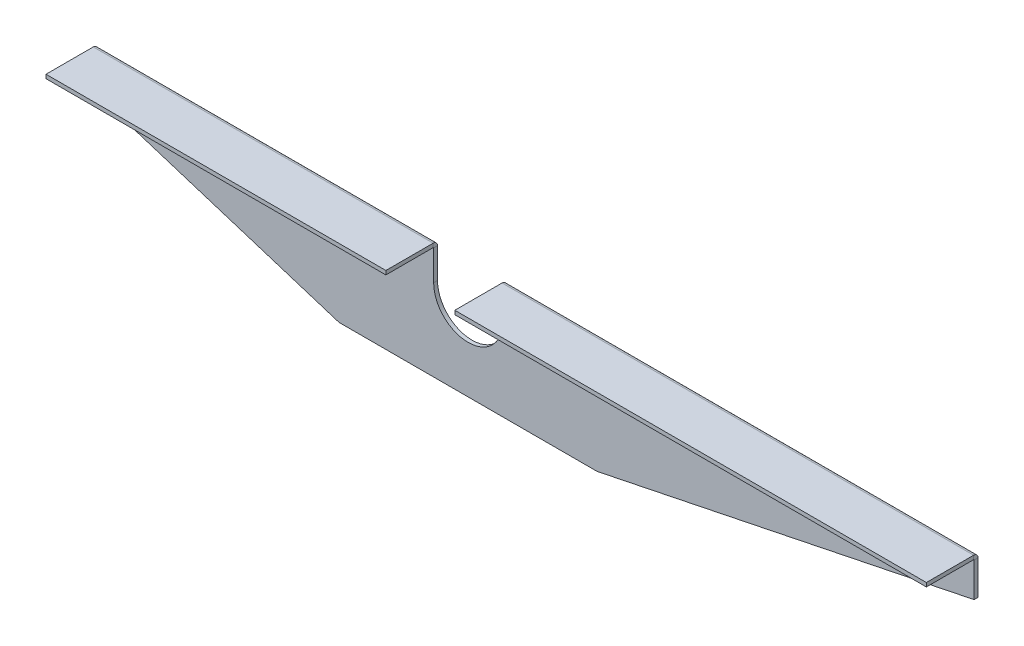
ISO-10303-21;
HEADER;
FILE_DESCRIPTION(('STEP AP214'),'2;1');
FILE_NAME('part.step','',(''),(''),'','','');
FILE_SCHEMA(('AUTOMOTIVE_DESIGN { 1 0 10303 214 1 1 1 1 }'));
ENDSEC;
DATA;
#1=APPLICATION_CONTEXT('core data for automotive mechanical design processes');
#2=APPLICATION_PROTOCOL_DEFINITION('international standard','automotive_design',2000,#1);
#3=PRODUCT_CONTEXT('',#1,'mechanical');
#4=PRODUCT('Part','Part','',(#3));
#5=PRODUCT_RELATED_PRODUCT_CATEGORY('part','',(#4));
#6=PRODUCT_DEFINITION_FORMATION('','',#4);
#7=PRODUCT_DEFINITION_CONTEXT('part definition',#1,'design');
#8=PRODUCT_DEFINITION('design','',#6,#7);
#9=PRODUCT_DEFINITION_SHAPE('','',#8);
#10=(LENGTH_UNIT() NAMED_UNIT(*) SI_UNIT(.MILLI.,.METRE.));
#11=(NAMED_UNIT(*) PLANE_ANGLE_UNIT() SI_UNIT($,.RADIAN.));
#12=(NAMED_UNIT(*) SI_UNIT($,.STERADIAN.) SOLID_ANGLE_UNIT());
#13=UNCERTAINTY_MEASURE_WITH_UNIT(LENGTH_MEASURE(1.E-05),#10,'distance_accuracy_value','');
#14=(GEOMETRIC_REPRESENTATION_CONTEXT(3) GLOBAL_UNCERTAINTY_ASSIGNED_CONTEXT((#13)) GLOBAL_UNIT_ASSIGNED_CONTEXT((#10,
#11,#12)) REPRESENTATION_CONTEXT('',''));
#15=CARTESIAN_POINT('',(0.,0.,0.));
#16=DIRECTION('',(0.,0.,1.));
#17=DIRECTION('',(1.,0.,0.));
#18=AXIS2_PLACEMENT_3D('',#15,#16,#17);
#19=CARTESIAN_POINT('',(0.,0.,-1.5));
#20=DIRECTION('',(0.,0.,1.));
#21=DIRECTION('',(1.,0.,0.));
#22=AXIS2_PLACEMENT_3D('',#19,#20,#21);
#23=PLANE('',#22);
#24=DIRECTION('',(-1.,0.,0.));
#25=VECTOR('',#24,1.);
#26=CARTESIAN_POINT('',(13.35,11.65,-1.50000000000033));
#27=LINE('',#26,#25);
#28=CARTESIAN_POINT('',(13.35,11.65,-1.50000000000033));
#29=VERTEX_POINT('',#28);
#30=CARTESIAN_POINT('',(196.,11.65,-1.50000000000033));
#31=VERTEX_POINT('',#30);
#32=EDGE_CURVE('E267',#29,#31,#27,.F.);
#33=ORIENTED_EDGE('',*,*,#32,.T.);
#34=DIRECTION('',(0.,1.,0.));
#35=VECTOR('',#34,1.);
#36=CARTESIAN_POINT('',(196.,13.35,-1.50000000000033));
#37=LINE('',#36,#35);
#38=CARTESIAN_POINT('',(196.,-1.65000000000004,-1.50000000000033));
#39=VERTEX_POINT('',#38);
#40=EDGE_CURVE('E393',#39,#31,#37,.T.);
#41=ORIENTED_EDGE('',*,*,#40,.F.);
#42=DIRECTION('',(0.979534918634303,0.201274298349514,0.));
#43=VECTOR('',#42,1.);
#44=CARTESIAN_POINT('',(196.,-1.65000000000004,-1.50000000000033));
#45=LINE('',#44,#43);
#46=CARTESIAN_POINT('',(50.,-31.65,-1.50000000000011));
#47=VERTEX_POINT('',#46);
#48=EDGE_CURVE('E389',#47,#39,#45,.T.);
#49=ORIENTED_EDGE('',*,*,#48,.F.);
#50=DIRECTION('',(1.,0.,0.));
#51=VECTOR('',#50,1.);
#52=CARTESIAN_POINT('',(50.,-31.65,-1.50000000000011));
#53=LINE('',#52,#51);
#54=CARTESIAN_POINT('',(-50.0000000000001,-31.65,-1.50000000000033));
#55=VERTEX_POINT('',#54);
#56=EDGE_CURVE('E385',#55,#47,#53,.T.);
#57=ORIENTED_EDGE('',*,*,#56,.F.);
#58=DIRECTION('',(0.953582665134142,-0.301131367937097,0.));
#59=VECTOR('',#58,1.);
#60=CARTESIAN_POINT('',(-50.0000000000001,-31.65,-1.50000000000033));
#61=LINE('',#60,#59);
#62=CARTESIAN_POINT('',(-145.,-1.65000000000004,-1.5));
#63=VERTEX_POINT('',#62);
#64=EDGE_CURVE('E381',#63,#55,#61,.T.);
#65=ORIENTED_EDGE('',*,*,#64,.F.);
#66=DIRECTION('',(0.,-1.,0.));
#67=VECTOR('',#66,1.);
#68=CARTESIAN_POINT('',(-145.,-1.65000000000004,-1.5));
#69=LINE('',#68,#67);
#70=CARTESIAN_POINT('',(-145.,11.65,-1.50000000000006));
#71=VERTEX_POINT('',#70);
#72=EDGE_CURVE('E378',#71,#63,#69,.T.);
#73=ORIENTED_EDGE('',*,*,#72,.F.);
#74=DIRECTION('',(-1.,0.,0.));
#75=VECTOR('',#74,1.);
#76=CARTESIAN_POINT('',(-145.,11.65,-1.50000000000006));
#77=LINE('',#76,#75);
#78=CARTESIAN_POINT('',(-13.35,11.65,-1.50000000000011));
#79=VERTEX_POINT('',#78);
#80=EDGE_CURVE('E338',#71,#79,#77,.F.);
#81=ORIENTED_EDGE('',*,*,#80,.T.);
#82=DIRECTION('',(0.,1.,0.));
#83=VECTOR('',#82,1.);
#84=CARTESIAN_POINT('',(-13.35,13.35,-1.50000000000011));
#85=LINE('',#84,#83);
#86=CARTESIAN_POINT('',(-13.35,0.,-1.50000000000011));
#87=VERTEX_POINT('',#86);
#88=EDGE_CURVE('E373',#87,#79,#85,.T.);
#89=ORIENTED_EDGE('',*,*,#88,.F.);
#90=CARTESIAN_POINT('',(0.,0.,-1.5));
#91=DIRECTION('',(0.,0.,-1.));
#92=DIRECTION('',(1.,0.,0.));
#93=AXIS2_PLACEMENT_3D('',#90,#91,#92);
#94=CIRCLE('',#93,13.35);
#95=CARTESIAN_POINT('',(13.35,0.,-1.50000000000033));
#96=VERTEX_POINT('',#95);
#97=EDGE_CURVE('E369',#96,#87,#94,.T.);
#98=ORIENTED_EDGE('',*,*,#97,.F.);
#99=DIRECTION('',(0.,-1.,0.));
#100=VECTOR('',#99,1.);
#101=CARTESIAN_POINT('',(13.35,0.,-1.50000000000033));
#102=LINE('',#101,#100);
#103=EDGE_CURVE('E396',#29,#96,#102,.T.);
#104=ORIENTED_EDGE('',*,*,#103,.F.);
#105=EDGE_LOOP('',(#33,#41,#49,#57,#65,#73,#81,#89,#98,#104));
#106=FACE_BOUND('',#105,.T.);
#107=ADVANCED_FACE('F84',(#106),#23,.F.);
#108=CARTESIAN_POINT('',(0.,0.,0.));
#109=DIRECTION('',(0.,0.,1.));
#110=DIRECTION('',(1.,0.,0.));
#111=AXIS2_PLACEMENT_3D('',#108,#109,#110);
#112=PLANE('',#111);
#113=DIRECTION('',(0.,1.,0.));
#114=VECTOR('',#113,1.);
#115=CARTESIAN_POINT('',(196.,13.35,-3.33066907387547E-13));
#116=LINE('',#115,#114);
#117=CARTESIAN_POINT('',(196.,-1.65000000000004,-3.33066907387547E-13));
#118=VERTEX_POINT('',#117);
#119=CARTESIAN_POINT('',(196.,11.65,-3.33066907387547E-13));
#120=VERTEX_POINT('',#119);
#121=EDGE_CURVE('E421',#118,#120,#116,.T.);
#122=ORIENTED_EDGE('',*,*,#121,.T.);
#123=DIRECTION('',(-1.,0.,0.));
#124=VECTOR('',#123,1.);
#125=CARTESIAN_POINT('',(13.35,11.65,-3.33066907387547E-13));
#126=LINE('',#125,#124);
#127=CARTESIAN_POINT('',(13.35,11.65,-3.33066907387547E-13));
#128=VERTEX_POINT('',#127);
#129=EDGE_CURVE('E102',#128,#120,#126,.F.);
#130=ORIENTED_EDGE('',*,*,#129,.F.);
#131=DIRECTION('',(0.,-1.,0.));
#132=VECTOR('',#131,1.);
#133=CARTESIAN_POINT('',(13.35,0.,-3.33066907387547E-13));
#134=LINE('',#133,#132);
#135=CARTESIAN_POINT('',(13.35,0.,-3.33066907387547E-13));
#136=VERTEX_POINT('',#135);
#137=EDGE_CURVE('E374',#128,#136,#134,.T.);
#138=ORIENTED_EDGE('',*,*,#137,.T.);
#139=CARTESIAN_POINT('',(0.,0.,0.));
#140=DIRECTION('',(0.,0.,-1.));
#141=DIRECTION('',(1.,0.,0.));
#142=AXIS2_PLACEMENT_3D('',#139,#140,#141);
#143=CIRCLE('',#142,13.35);
#144=CARTESIAN_POINT('',(-13.35,0.,-1.11022302462516E-13));
#145=VERTEX_POINT('',#144);
#146=EDGE_CURVE('E365',#136,#145,#143,.T.);
#147=ORIENTED_EDGE('',*,*,#146,.T.);
#148=DIRECTION('',(0.,1.,0.));
#149=VECTOR('',#148,1.);
#150=CARTESIAN_POINT('',(-13.35,13.35,-1.11022302462516E-13));
#151=LINE('',#150,#149);
#152=CARTESIAN_POINT('',(-13.35,11.65,-1.11022302462516E-13));
#153=VERTEX_POINT('',#152);
#154=EDGE_CURVE('E402',#145,#153,#151,.T.);
#155=ORIENTED_EDGE('',*,*,#154,.T.);
#156=DIRECTION('',(-1.,0.,0.));
#157=VECTOR('',#156,1.);
#158=CARTESIAN_POINT('',(-145.,11.65,0.));
#159=LINE('',#158,#157);
#160=CARTESIAN_POINT('',(-145.,11.65,0.));
#161=VERTEX_POINT('',#160);
#162=EDGE_CURVE('E354',#161,#153,#159,.F.);
#163=ORIENTED_EDGE('',*,*,#162,.F.);
#164=DIRECTION('',(0.,-1.,0.));
#165=VECTOR('',#164,1.);
#166=CARTESIAN_POINT('',(-145.,-1.65000000000004,0.));
#167=LINE('',#166,#165);
#168=CARTESIAN_POINT('',(-145.,-1.65000000000004,0.));
#169=VERTEX_POINT('',#168);
#170=EDGE_CURVE('E406',#161,#169,#167,.T.);
#171=ORIENTED_EDGE('',*,*,#170,.T.);
#172=DIRECTION('',(0.953582665134142,-0.301131367937097,0.));
#173=VECTOR('',#172,1.);
#174=CARTESIAN_POINT('',(-50.,-31.65,-3.33066907387547E-13));
#175=LINE('',#174,#173);
#176=CARTESIAN_POINT('',(-50.,-31.65,-3.33066907387547E-13));
#177=VERTEX_POINT('',#176);
#178=EDGE_CURVE('E409',#169,#177,#175,.T.);
#179=ORIENTED_EDGE('',*,*,#178,.T.);
#180=DIRECTION('',(1.,0.,0.));
#181=VECTOR('',#180,1.);
#182=CARTESIAN_POINT('',(50.,-31.65,-1.11022302462516E-13));
#183=LINE('',#182,#181);
#184=CARTESIAN_POINT('',(50.,-31.65,-1.11022302462516E-13));
#185=VERTEX_POINT('',#184);
#186=EDGE_CURVE('E413',#177,#185,#183,.T.);
#187=ORIENTED_EDGE('',*,*,#186,.T.);
#188=DIRECTION('',(0.979534918634303,0.201274298349514,0.));
#189=VECTOR('',#188,1.);
#190=CARTESIAN_POINT('',(196.,-1.65000000000004,-3.33066907387547E-13));
#191=LINE('',#190,#189);
#192=EDGE_CURVE('E417',#185,#118,#191,.T.);
#193=ORIENTED_EDGE('',*,*,#192,.T.);
#194=EDGE_LOOP('',(#122,#130,#138,#147,#155,#163,#171,#179,#187,#193));
#195=FACE_BOUND('',#194,.T.);
#196=ADVANCED_FACE('F451',(#195),#112,.T.);
#197=CARTESIAN_POINT('',(13.35,0.,-1.50000000000033));
#198=DIRECTION('',(-1.,0.,0.));
#199=DIRECTION('',(0.,0.,1.));
#200=AXIS2_PLACEMENT_3D('',#197,#198,#199);
#201=PLANE('',#200);
#202=ORIENTED_EDGE('',*,*,#137,.F.);
#203=DIRECTION('',(0.,0.,-1.));
#204=VECTOR('',#203,1.);
#205=CARTESIAN_POINT('',(13.35,11.65,-3.33066907387547E-13));
#206=LINE('',#205,#204);
#207=EDGE_CURVE('E276',#128,#29,#206,.T.);
#208=ORIENTED_EDGE('',*,*,#207,.T.);
#209=ORIENTED_EDGE('',*,*,#103,.T.);
#210=DIRECTION('',(0.,0.,1.));
#211=VECTOR('',#210,1.);
#212=CARTESIAN_POINT('',(13.35,0.,-1.50000000000033));
#213=LINE('',#212,#211);
#214=EDGE_CURVE('E13',#96,#136,#213,.T.);
#215=ORIENTED_EDGE('',*,*,#214,.T.);
#216=EDGE_LOOP('',(#202,#208,#209,#215));
#217=FACE_BOUND('',#216,.T.);
#218=ADVANCED_FACE('F454',(#217),#201,.T.);
#219=CARTESIAN_POINT('',(-145.,-1.65000000000004,-1.5));
#220=DIRECTION('',(-1.,0.,0.));
#221=DIRECTION('',(0.,0.,1.));
#222=AXIS2_PLACEMENT_3D('',#219,#220,#221);
#223=PLANE('',#222);
#224=ORIENTED_EDGE('',*,*,#170,.F.);
#225=DIRECTION('',(0.,0.,-1.));
#226=VECTOR('',#225,1.);
#227=CARTESIAN_POINT('',(-145.,11.65,0.));
#228=LINE('',#227,#226);
#229=EDGE_CURVE('E346',#161,#71,#228,.T.);
#230=ORIENTED_EDGE('',*,*,#229,.T.);
#231=ORIENTED_EDGE('',*,*,#72,.T.);
#232=DIRECTION('',(0.,0.,1.));
#233=VECTOR('',#232,1.);
#234=CARTESIAN_POINT('',(-145.,-1.65000000000004,-1.5));
#235=LINE('',#234,#233);
#236=EDGE_CURVE('E433',#63,#169,#235,.T.);
#237=ORIENTED_EDGE('',*,*,#236,.T.);
#238=EDGE_LOOP('',(#224,#230,#231,#237));
#239=FACE_BOUND('',#238,.T.);
#240=ADVANCED_FACE('F509',(#239),#223,.T.);
#241=CARTESIAN_POINT('',(0.,0.,-1.5));
#242=DIRECTION('',(0.,0.,1.));
#243=DIRECTION('',(1.,0.,0.));
#244=AXIS2_PLACEMENT_3D('',#241,#242,#243);
#245=CYLINDRICAL_SURFACE('',#244,13.35);
#246=ORIENTED_EDGE('',*,*,#146,.F.);
#247=ORIENTED_EDGE('',*,*,#214,.F.);
#248=ORIENTED_EDGE('',*,*,#97,.T.);
#249=DIRECTION('',(0.,0.,1.));
#250=VECTOR('',#249,1.);
#251=CARTESIAN_POINT('',(-13.35,0.,-1.50000000000011));
#252=LINE('',#251,#250);
#253=EDGE_CURVE('E88',#87,#145,#252,.T.);
#254=ORIENTED_EDGE('',*,*,#253,.T.);
#255=EDGE_LOOP('',(#246,#247,#248,#254));
#256=FACE_BOUND('',#255,.T.);
#257=ADVANCED_FACE('F86',(#256),#245,.F.);
#258=CARTESIAN_POINT('',(196.,13.35,-1.50000000000033));
#259=DIRECTION('',(1.,0.,0.));
#260=DIRECTION('',(0.,0.,-1.));
#261=AXIS2_PLACEMENT_3D('',#258,#259,#260);
#262=PLANE('',#261);
#263=DIRECTION('',(0.,0.,-1.));
#264=VECTOR('',#263,1.);
#265=CARTESIAN_POINT('',(196.,11.65,-3.33066907387547E-13));
#266=LINE('',#265,#264);
#267=EDGE_CURVE('E110',#120,#31,#266,.T.);
#268=ORIENTED_EDGE('',*,*,#267,.F.);
#269=ORIENTED_EDGE('',*,*,#121,.F.);
#270=DIRECTION('',(0.,0.,1.));
#271=VECTOR('',#270,1.);
#272=CARTESIAN_POINT('',(196.,-1.65000000000004,-1.50000000000033));
#273=LINE('',#272,#271);
#274=EDGE_CURVE('E94',#39,#118,#273,.T.);
#275=ORIENTED_EDGE('',*,*,#274,.F.);
#276=ORIENTED_EDGE('',*,*,#40,.T.);
#277=EDGE_LOOP('',(#268,#269,#275,#276));
#278=FACE_BOUND('',#277,.T.);
#279=ADVANCED_FACE('F510',(#278),#262,.T.);
#280=CARTESIAN_POINT('',(196.,-1.65000000000004,-1.50000000000033));
#281=DIRECTION('',(0.201274298349514,-0.979534918634303,0.));
#282=DIRECTION('',(0.979534918634303,0.201274298349514,0.));
#283=AXIS2_PLACEMENT_3D('',#280,#281,#282);
#284=PLANE('',#283);
#285=ORIENTED_EDGE('',*,*,#192,.F.);
#286=DIRECTION('',(0.,0.,1.));
#287=VECTOR('',#286,1.);
#288=CARTESIAN_POINT('',(50.,-31.65,-1.50000000000011));
#289=LINE('',#288,#287);
#290=EDGE_CURVE('E428',#47,#185,#289,.T.);
#291=ORIENTED_EDGE('',*,*,#290,.F.);
#292=ORIENTED_EDGE('',*,*,#48,.T.);
#293=ORIENTED_EDGE('',*,*,#274,.T.);
#294=EDGE_LOOP('',(#285,#291,#292,#293));
#295=FACE_BOUND('',#294,.T.);
#296=ADVANCED_FACE('F513',(#295),#284,.T.);
#297=CARTESIAN_POINT('',(50.,-31.65,-1.50000000000011));
#298=DIRECTION('',(0.,-1.,0.));
#299=DIRECTION('',(1.,0.,0.));
#300=AXIS2_PLACEMENT_3D('',#297,#298,#299);
#301=PLANE('',#300);
#302=ORIENTED_EDGE('',*,*,#186,.F.);
#303=DIRECTION('',(0.,0.,1.));
#304=VECTOR('',#303,1.);
#305=CARTESIAN_POINT('',(-50.0000000000001,-31.65,-1.50000000000033));
#306=LINE('',#305,#304);
#307=EDGE_CURVE('E431',#55,#177,#306,.T.);
#308=ORIENTED_EDGE('',*,*,#307,.F.);
#309=ORIENTED_EDGE('',*,*,#56,.T.);
#310=ORIENTED_EDGE('',*,*,#290,.T.);
#311=EDGE_LOOP('',(#302,#308,#309,#310));
#312=FACE_BOUND('',#311,.T.);
#313=ADVANCED_FACE('F516',(#312),#301,.T.);
#314=CARTESIAN_POINT('',(-50.0000000000001,-31.65,-1.50000000000033));
#315=DIRECTION('',(-0.301131367937097,-0.953582665134142,0.));
#316=DIRECTION('',(0.953582665134142,-0.301131367937097,0.));
#317=AXIS2_PLACEMENT_3D('',#314,#315,#316);
#318=PLANE('',#317);
#319=ORIENTED_EDGE('',*,*,#178,.F.);
#320=ORIENTED_EDGE('',*,*,#236,.F.);
#321=ORIENTED_EDGE('',*,*,#64,.T.);
#322=ORIENTED_EDGE('',*,*,#307,.T.);
#323=EDGE_LOOP('',(#319,#320,#321,#322));
#324=FACE_BOUND('',#323,.T.);
#325=ADVANCED_FACE('F520',(#324),#318,.T.);
#326=CARTESIAN_POINT('',(-13.35,13.35,-1.50000000000011));
#327=DIRECTION('',(1.,0.,0.));
#328=DIRECTION('',(0.,0.,-1.));
#329=AXIS2_PLACEMENT_3D('',#326,#327,#328);
#330=PLANE('',#329);
#331=DIRECTION('',(0.,0.,-1.));
#332=VECTOR('',#331,1.);
#333=CARTESIAN_POINT('',(-13.35,11.65,-1.11022302462516E-13));
#334=LINE('',#333,#332);
#335=EDGE_CURVE('E361',#153,#79,#334,.T.);
#336=ORIENTED_EDGE('',*,*,#335,.F.);
#337=ORIENTED_EDGE('',*,*,#154,.F.);
#338=ORIENTED_EDGE('',*,*,#253,.F.);
#339=ORIENTED_EDGE('',*,*,#88,.T.);
#340=EDGE_LOOP('',(#336,#337,#338,#339));
#341=FACE_BOUND('',#340,.T.);
#342=ADVANCED_FACE('F450',(#341),#330,.T.);
#343=CARTESIAN_POINT('',(-13.35,11.65,0.199999999999867));
#344=DIRECTION('',(1.,0.,0.));
#345=DIRECTION('',(0.,0.,-1.));
#346=AXIS2_PLACEMENT_3D('',#343,#344,#345);
#347=PLANE('',#346);
#348=DIRECTION('',(0.,-1.,0.));
#349=VECTOR('',#348,1.);
#350=CARTESIAN_POINT('',(-13.35,13.35,0.199999999999867));
#351=LINE('',#350,#349);
#352=CARTESIAN_POINT('',(-13.35,11.85,0.199999999999867));
#353=VERTEX_POINT('',#352);
#354=CARTESIAN_POINT('',(-13.35,13.35,0.199999999999867));
#355=VERTEX_POINT('',#354);
#356=EDGE_CURVE('E292',#353,#355,#351,.F.);
#357=ORIENTED_EDGE('',*,*,#356,.F.);
#358=CARTESIAN_POINT('',(-13.35,11.65,0.199999999999867));
#359=DIRECTION('',(-1.,0.,0.));
#360=DIRECTION('',(0.,0.,1.));
#361=AXIS2_PLACEMENT_3D('',#358,#359,#360);
#362=CIRCLE('',#361,0.200000000000001);
#363=EDGE_CURVE('E350',#153,#353,#362,.F.);
#364=ORIENTED_EDGE('',*,*,#363,.F.);
#365=ORIENTED_EDGE('',*,*,#335,.T.);
#366=CARTESIAN_POINT('',(-13.35,11.65,0.199999999999867));
#367=DIRECTION('',(-1.,0.,0.));
#368=DIRECTION('',(0.,0.,1.));
#369=AXIS2_PLACEMENT_3D('',#366,#367,#368);
#370=CIRCLE('',#369,1.7);
#371=EDGE_CURVE('E341',#79,#355,#370,.F.);
#372=ORIENTED_EDGE('',*,*,#371,.T.);
#373=EDGE_LOOP('',(#357,#364,#365,#372));
#374=FACE_BOUND('',#373,.T.);
#375=ADVANCED_FACE('F460',(#374),#347,.T.);
#376=CARTESIAN_POINT('',(-145.,11.65,0.199999999999978));
#377=DIRECTION('',(1.,0.,0.));
#378=DIRECTION('',(0.,0.,-1.));
#379=AXIS2_PLACEMENT_3D('',#376,#377,#378);
#380=PLANE('',#379);
#381=CARTESIAN_POINT('',(-145.,11.65,0.199999999999978));
#382=DIRECTION('',(-1.,0.,0.));
#383=DIRECTION('',(0.,0.,1.));
#384=AXIS2_PLACEMENT_3D('',#381,#382,#383);
#385=CIRCLE('',#384,0.200000000000001);
#386=CARTESIAN_POINT('',(-145.,11.85,0.199999999999978));
#387=VERTEX_POINT('',#386);
#388=EDGE_CURVE('E300',#387,#161,#385,.T.);
#389=ORIENTED_EDGE('',*,*,#388,.F.);
#390=DIRECTION('',(0.,-1.,0.));
#391=VECTOR('',#390,1.);
#392=CARTESIAN_POINT('',(-145.,11.85,0.199999999999978));
#393=LINE('',#392,#391);
#394=CARTESIAN_POINT('',(-145.,13.35,0.199999999999978));
#395=VERTEX_POINT('',#394);
#396=EDGE_CURVE('E328',#387,#395,#393,.F.);
#397=ORIENTED_EDGE('',*,*,#396,.T.);
#398=CARTESIAN_POINT('',(-145.,11.65,0.199999999999978));
#399=DIRECTION('',(-1.,0.,0.));
#400=DIRECTION('',(0.,0.,1.));
#401=AXIS2_PLACEMENT_3D('',#398,#399,#400);
#402=CIRCLE('',#401,1.7);
#403=EDGE_CURVE('E342',#395,#71,#402,.T.);
#404=ORIENTED_EDGE('',*,*,#403,.T.);
#405=ORIENTED_EDGE('',*,*,#229,.F.);
#406=EDGE_LOOP('',(#389,#397,#404,#405));
#407=FACE_BOUND('',#406,.T.);
#408=ADVANCED_FACE('F504',(#407),#380,.F.);
#409=CARTESIAN_POINT('',(-145.,11.65,0.199999999999978));
#410=DIRECTION('',(-1.,0.,0.));
#411=DIRECTION('',(0.,1.,0.));
#412=AXIS2_PLACEMENT_3D('',#409,#410,#411);
#413=CYLINDRICAL_SURFACE('',#412,1.7);
#414=ORIENTED_EDGE('',*,*,#80,.F.);
#415=ORIENTED_EDGE('',*,*,#403,.F.);
#416=DIRECTION('',(-1.,0.,0.));
#417=VECTOR('',#416,1.);
#418=CARTESIAN_POINT('',(-13.35,13.35,0.199999999999867));
#419=LINE('',#418,#417);
#420=EDGE_CURVE('E325',#395,#355,#419,.F.);
#421=ORIENTED_EDGE('',*,*,#420,.T.);
#422=ORIENTED_EDGE('',*,*,#371,.F.);
#423=EDGE_LOOP('',(#414,#415,#421,#422));
#424=FACE_BOUND('',#423,.T.);
#425=ADVANCED_FACE('F462',(#424),#413,.T.);
#426=CARTESIAN_POINT('',(-145.,11.65,0.199999999999978));
#427=DIRECTION('',(-1.,0.,0.));
#428=DIRECTION('',(0.,1.,0.));
#429=AXIS2_PLACEMENT_3D('',#426,#427,#428);
#430=CYLINDRICAL_SURFACE('',#429,0.200000000000001);
#431=ORIENTED_EDGE('',*,*,#162,.T.);
#432=ORIENTED_EDGE('',*,*,#363,.T.);
#433=DIRECTION('',(-1.,0.,0.));
#434=VECTOR('',#433,1.);
#435=CARTESIAN_POINT('',(-13.35,11.85,0.199999999999867));
#436=LINE('',#435,#434);
#437=EDGE_CURVE('E332',#353,#387,#436,.T.);
#438=ORIENTED_EDGE('',*,*,#437,.T.);
#439=ORIENTED_EDGE('',*,*,#388,.T.);
#440=EDGE_LOOP('',(#431,#432,#438,#439));
#441=FACE_BOUND('',#440,.T.);
#442=ADVANCED_FACE('F483',(#441),#430,.F.);
#443=CARTESIAN_POINT('',(-145.,13.3500000000001,18.5));
#444=DIRECTION('',(1.,0.,0.));
#445=DIRECTION('',(0.,1.,0.));
#446=AXIS2_PLACEMENT_3D('',#443,#444,#445);
#447=PLANE('',#446);
#448=ORIENTED_EDGE('',*,*,#396,.F.);
#449=DIRECTION('',(0.,0.,-1.));
#450=VECTOR('',#449,1.);
#451=CARTESIAN_POINT('',(-145.,11.85,18.5));
#452=LINE('',#451,#450);
#453=CARTESIAN_POINT('',(-145.,11.85,18.5));
#454=VERTEX_POINT('',#453);
#455=EDGE_CURVE('E322',#387,#454,#452,.F.);
#456=ORIENTED_EDGE('',*,*,#455,.T.);
#457=DIRECTION('',(0.,-1.,0.));
#458=VECTOR('',#457,1.);
#459=CARTESIAN_POINT('',(-145.,13.3500000000001,18.5));
#460=LINE('',#459,#458);
#461=CARTESIAN_POINT('',(-145.,13.3500000000001,18.5));
#462=VERTEX_POINT('',#461);
#463=EDGE_CURVE('E296',#462,#454,#460,.T.);
#464=ORIENTED_EDGE('',*,*,#463,.F.);
#465=DIRECTION('',(0.,0.,1.));
#466=VECTOR('',#465,1.);
#467=CARTESIAN_POINT('',(-145.,13.35,0.));
#468=LINE('',#467,#466);
#469=EDGE_CURVE('E312',#395,#462,#468,.T.);
#470=ORIENTED_EDGE('',*,*,#469,.F.);
#471=EDGE_LOOP('',(#448,#456,#464,#470));
#472=FACE_BOUND('',#471,.T.);
#473=ADVANCED_FACE('F471',(#472),#447,.F.);
#474=CARTESIAN_POINT('',(-13.35,13.35,-1.11022302462516E-13));
#475=DIRECTION('',(-1.,0.,0.));
#476=DIRECTION('',(0.,0.,1.));
#477=AXIS2_PLACEMENT_3D('',#474,#475,#476);
#478=PLANE('',#477);
#479=ORIENTED_EDGE('',*,*,#356,.T.);
#480=DIRECTION('',(0.,0.,-1.));
#481=VECTOR('',#480,1.);
#482=CARTESIAN_POINT('',(-13.35,13.35,-1.66533453693773E-13));
#483=LINE('',#482,#481);
#484=CARTESIAN_POINT('',(-13.3500000000002,13.3500000000001,18.4999999999999));
#485=VERTEX_POINT('',#484);
#486=EDGE_CURVE('E305',#485,#355,#483,.T.);
#487=ORIENTED_EDGE('',*,*,#486,.F.);
#488=DIRECTION('',(0.,-1.,0.));
#489=VECTOR('',#488,1.);
#490=CARTESIAN_POINT('',(-13.3500000000002,13.3500000000001,18.4999999999999));
#491=LINE('',#490,#489);
#492=CARTESIAN_POINT('',(-13.3500000000002,11.85,18.4999999999999));
#493=VERTEX_POINT('',#492);
#494=EDGE_CURVE('E301',#485,#493,#491,.T.);
#495=ORIENTED_EDGE('',*,*,#494,.T.);
#496=DIRECTION('',(0.,0.,1.));
#497=VECTOR('',#496,1.);
#498=CARTESIAN_POINT('',(-13.35,11.85,-1.11022302462516E-13));
#499=LINE('',#498,#497);
#500=EDGE_CURVE('E315',#493,#353,#499,.F.);
#501=ORIENTED_EDGE('',*,*,#500,.T.);
#502=EDGE_LOOP('',(#479,#487,#495,#501));
#503=FACE_BOUND('',#502,.T.);
#504=ADVANCED_FACE('F480',(#503),#478,.F.);
#505=CARTESIAN_POINT('',(0.,13.35,0.));
#506=DIRECTION('',(0.,-1.,0.));
#507=DIRECTION('',(0.,0.,-1.));
#508=AXIS2_PLACEMENT_3D('',#505,#506,#507);
#509=PLANE('',#508);
#510=ORIENTED_EDGE('',*,*,#420,.F.);
#511=ORIENTED_EDGE('',*,*,#469,.T.);
#512=DIRECTION('',(1.,0.,0.));
#513=VECTOR('',#512,1.);
#514=CARTESIAN_POINT('',(-1.66533453693773E-13,13.3500000000001,18.5));
#515=LINE('',#514,#513);
#516=EDGE_CURVE('E309',#462,#485,#515,.T.);
#517=ORIENTED_EDGE('',*,*,#516,.T.);
#518=ORIENTED_EDGE('',*,*,#486,.T.);
#519=EDGE_LOOP('',(#510,#511,#517,#518));
#520=FACE_BOUND('',#519,.T.);
#521=ADVANCED_FACE('F466',(#520),#509,.F.);
#522=CARTESIAN_POINT('',(0.,11.85,0.));
#523=DIRECTION('',(0.,-1.,0.));
#524=DIRECTION('',(0.,0.,-1.));
#525=AXIS2_PLACEMENT_3D('',#522,#523,#524);
#526=PLANE('',#525);
#527=ORIENTED_EDGE('',*,*,#455,.F.);
#528=ORIENTED_EDGE('',*,*,#437,.F.);
#529=ORIENTED_EDGE('',*,*,#500,.F.);
#530=DIRECTION('',(-1.,0.,0.));
#531=VECTOR('',#530,1.);
#532=CARTESIAN_POINT('',(-13.3500000000002,11.85,18.4999999999999));
#533=LINE('',#532,#531);
#534=EDGE_CURVE('E319',#454,#493,#533,.F.);
#535=ORIENTED_EDGE('',*,*,#534,.F.);
#536=EDGE_LOOP('',(#527,#528,#529,#535));
#537=FACE_BOUND('',#536,.T.);
#538=ADVANCED_FACE('F486',(#537),#526,.T.);
#539=CARTESIAN_POINT('',(-13.3500000000002,13.3500000000001,18.4999999999999));
#540=DIRECTION('',(0.,0.,-1.));
#541=DIRECTION('',(0.,1.,0.));
#542=AXIS2_PLACEMENT_3D('',#539,#540,#541);
#543=PLANE('',#542);
#544=ORIENTED_EDGE('',*,*,#534,.T.);
#545=ORIENTED_EDGE('',*,*,#494,.F.);
#546=ORIENTED_EDGE('',*,*,#516,.F.);
#547=ORIENTED_EDGE('',*,*,#463,.T.);
#548=EDGE_LOOP('',(#544,#545,#546,#547));
#549=FACE_BOUND('',#548,.T.);
#550=ADVANCED_FACE('F477',(#549),#543,.F.);
#551=CARTESIAN_POINT('',(196.,11.65,0.199999999999645));
#552=DIRECTION('',(1.,0.,0.));
#553=DIRECTION('',(0.,0.,-1.));
#554=AXIS2_PLACEMENT_3D('',#551,#552,#553);
#555=PLANE('',#554);
#556=DIRECTION('',(0.,-1.,0.));
#557=VECTOR('',#556,1.);
#558=CARTESIAN_POINT('',(196.,13.35,0.199999999999645));
#559=LINE('',#558,#557);
#560=CARTESIAN_POINT('',(196.,11.85,0.199999999999645));
#561=VERTEX_POINT('',#560);
#562=CARTESIAN_POINT('',(196.,13.35,0.199999999999645));
#563=VERTEX_POINT('',#562);
#564=EDGE_CURVE('E239',#561,#563,#559,.F.);
#565=ORIENTED_EDGE('',*,*,#564,.F.);
#566=CARTESIAN_POINT('',(196.,11.65,0.199999999999645));
#567=DIRECTION('',(-1.,0.,0.));
#568=DIRECTION('',(0.,0.,1.));
#569=AXIS2_PLACEMENT_3D('',#566,#567,#568);
#570=CIRCLE('',#569,0.200000000000002);
#571=EDGE_CURVE('E280',#120,#561,#570,.F.);
#572=ORIENTED_EDGE('',*,*,#571,.F.);
#573=ORIENTED_EDGE('',*,*,#267,.T.);
#574=CARTESIAN_POINT('',(196.,11.65,0.199999999999645));
#575=DIRECTION('',(-1.,0.,0.));
#576=DIRECTION('',(0.,0.,1.));
#577=AXIS2_PLACEMENT_3D('',#574,#575,#576);
#578=CIRCLE('',#577,1.7);
#579=EDGE_CURVE('E271',#31,#563,#578,.F.);
#580=ORIENTED_EDGE('',*,*,#579,.T.);
#581=EDGE_LOOP('',(#565,#572,#573,#580));
#582=FACE_BOUND('',#581,.T.);
#583=ADVANCED_FACE('F493',(#582),#555,.T.);
#584=CARTESIAN_POINT('',(13.35,11.65,0.199999999999645));
#585=DIRECTION('',(1.,0.,0.));
#586=DIRECTION('',(0.,0.,-1.));
#587=AXIS2_PLACEMENT_3D('',#584,#585,#586);
#588=PLANE('',#587);
#589=CARTESIAN_POINT('',(13.35,11.65,0.199999999999645));
#590=DIRECTION('',(-1.,0.,0.));
#591=DIRECTION('',(0.,0.,1.));
#592=AXIS2_PLACEMENT_3D('',#589,#590,#591);
#593=CIRCLE('',#592,0.200000000000002);
#594=CARTESIAN_POINT('',(13.35,11.85,0.199999999999645));
#595=VERTEX_POINT('',#594);
#596=EDGE_CURVE('E286',#595,#128,#593,.T.);
#597=ORIENTED_EDGE('',*,*,#596,.F.);
#598=DIRECTION('',(0.,-1.,0.));
#599=VECTOR('',#598,1.);
#600=CARTESIAN_POINT('',(13.35,11.85,0.199999999999645));
#601=LINE('',#600,#599);
#602=CARTESIAN_POINT('',(13.35,13.35,0.199999999999645));
#603=VERTEX_POINT('',#602);
#604=EDGE_CURVE('E258',#595,#603,#601,.F.);
#605=ORIENTED_EDGE('',*,*,#604,.T.);
#606=CARTESIAN_POINT('',(13.35,11.65,0.199999999999645));
#607=DIRECTION('',(-1.,0.,0.));
#608=DIRECTION('',(0.,0.,1.));
#609=AXIS2_PLACEMENT_3D('',#606,#607,#608);
#610=CIRCLE('',#609,1.7);
#611=EDGE_CURVE('E272',#603,#29,#610,.T.);
#612=ORIENTED_EDGE('',*,*,#611,.T.);
#613=ORIENTED_EDGE('',*,*,#207,.F.);
#614=EDGE_LOOP('',(#597,#605,#612,#613));
#615=FACE_BOUND('',#614,.T.);
#616=ADVANCED_FACE('F571',(#615),#588,.F.);
#617=CARTESIAN_POINT('',(13.35,11.65,0.199999999999645));
#618=DIRECTION('',(-1.,0.,0.));
#619=DIRECTION('',(0.,1.,0.));
#620=AXIS2_PLACEMENT_3D('',#617,#618,#619);
#621=CYLINDRICAL_SURFACE('',#620,1.7);
#622=ORIENTED_EDGE('',*,*,#32,.F.);
#623=ORIENTED_EDGE('',*,*,#611,.F.);
#624=DIRECTION('',(-1.,0.,0.));
#625=VECTOR('',#624,1.);
#626=CARTESIAN_POINT('',(196.,13.35,0.199999999999645));
#627=LINE('',#626,#625);
#628=EDGE_CURVE('E255',#603,#563,#627,.F.);
#629=ORIENTED_EDGE('',*,*,#628,.T.);
#630=ORIENTED_EDGE('',*,*,#579,.F.);
#631=EDGE_LOOP('',(#622,#623,#629,#630));
#632=FACE_BOUND('',#631,.T.);
#633=ADVANCED_FACE('F582',(#632),#621,.T.);
#634=CARTESIAN_POINT('',(13.35,11.65,0.199999999999645));
#635=DIRECTION('',(-1.,0.,0.));
#636=DIRECTION('',(0.,1.,0.));
#637=AXIS2_PLACEMENT_3D('',#634,#635,#636);
#638=CYLINDRICAL_SURFACE('',#637,0.200000000000002);
#639=ORIENTED_EDGE('',*,*,#129,.T.);
#640=ORIENTED_EDGE('',*,*,#571,.T.);
#641=DIRECTION('',(-1.,0.,0.));
#642=VECTOR('',#641,1.);
#643=CARTESIAN_POINT('',(196.,11.85,0.199999999999645));
#644=LINE('',#643,#642);
#645=EDGE_CURVE('E262',#561,#595,#644,.T.);
#646=ORIENTED_EDGE('',*,*,#645,.T.);
#647=ORIENTED_EDGE('',*,*,#596,.T.);
#648=EDGE_LOOP('',(#639,#640,#646,#647));
#649=FACE_BOUND('',#648,.T.);
#650=ADVANCED_FACE('F593',(#649),#638,.F.);
#651=CARTESIAN_POINT('',(13.3499999999997,13.3500000000001,18.4999999999997));
#652=DIRECTION('',(1.,0.,0.));
#653=DIRECTION('',(0.,0.,-1.));
#654=AXIS2_PLACEMENT_3D('',#651,#652,#653);
#655=PLANE('',#654);
#656=ORIENTED_EDGE('',*,*,#604,.F.);
#657=DIRECTION('',(0.,0.,-1.));
#658=VECTOR('',#657,1.);
#659=CARTESIAN_POINT('',(13.3499999999997,11.85,18.4999999999997));
#660=LINE('',#659,#658);
#661=CARTESIAN_POINT('',(13.3499999999997,11.85,18.4999999999997));
#662=VERTEX_POINT('',#661);
#663=EDGE_CURVE('E252',#595,#662,#660,.F.);
#664=ORIENTED_EDGE('',*,*,#663,.T.);
#665=DIRECTION('',(0.,-1.,0.));
#666=VECTOR('',#665,1.);
#667=CARTESIAN_POINT('',(13.3499999999997,13.3500000000001,18.4999999999997));
#668=LINE('',#667,#666);
#669=CARTESIAN_POINT('',(13.3499999999997,13.3500000000001,18.4999999999997));
#670=VERTEX_POINT('',#669);
#671=EDGE_CURVE('E235',#670,#662,#668,.T.);
#672=ORIENTED_EDGE('',*,*,#671,.F.);
#673=DIRECTION('',(0.,0.,1.));
#674=VECTOR('',#673,1.);
#675=CARTESIAN_POINT('',(13.35,13.35,-2.77555756156289E-13));
#676=LINE('',#675,#674);
#677=EDGE_CURVE('E220',#603,#670,#676,.T.);
#678=ORIENTED_EDGE('',*,*,#677,.F.);
#679=EDGE_LOOP('',(#656,#664,#672,#678));
#680=FACE_BOUND('',#679,.T.);
#681=ADVANCED_FACE('F604',(#680),#655,.F.);
#682=CARTESIAN_POINT('',(196.,13.35,-3.33066907387547E-13));
#683=DIRECTION('',(-1.,0.,0.));
#684=DIRECTION('',(0.,-1.,0.));
#685=AXIS2_PLACEMENT_3D('',#682,#683,#684);
#686=PLANE('',#685);
#687=ORIENTED_EDGE('',*,*,#564,.T.);
#688=DIRECTION('',(0.,0.,-1.));
#689=VECTOR('',#688,1.);
#690=CARTESIAN_POINT('',(196.,13.35,-3.88578058618805E-13));
#691=LINE('',#690,#689);
#692=CARTESIAN_POINT('',(196.,13.3500000000001,18.4999999999997));
#693=VERTEX_POINT('',#692);
#694=EDGE_CURVE('E218',#693,#563,#691,.T.);
#695=ORIENTED_EDGE('',*,*,#694,.F.);
#696=DIRECTION('',(0.,-1.,0.));
#697=VECTOR('',#696,1.);
#698=CARTESIAN_POINT('',(196.,13.3500000000001,18.4999999999997));
#699=LINE('',#698,#697);
#700=CARTESIAN_POINT('',(196.,11.85,18.4999999999997));
#701=VERTEX_POINT('',#700);
#702=EDGE_CURVE('E227',#693,#701,#699,.T.);
#703=ORIENTED_EDGE('',*,*,#702,.T.);
#704=DIRECTION('',(0.,0.,1.));
#705=VECTOR('',#704,1.);
#706=CARTESIAN_POINT('',(196.,11.85,-3.33066907387547E-13));
#707=LINE('',#706,#705);
#708=EDGE_CURVE('E247',#701,#561,#707,.F.);
#709=ORIENTED_EDGE('',*,*,#708,.T.);
#710=EDGE_LOOP('',(#687,#695,#703,#709));
#711=FACE_BOUND('',#710,.T.);
#712=ADVANCED_FACE('F238',(#711),#686,.F.);
#713=CARTESIAN_POINT('',(0.,13.35,0.));
#714=DIRECTION('',(0.,-1.,0.));
#715=DIRECTION('',(0.,0.,-1.));
#716=AXIS2_PLACEMENT_3D('',#713,#714,#715);
#717=PLANE('',#716);
#718=ORIENTED_EDGE('',*,*,#628,.F.);
#719=ORIENTED_EDGE('',*,*,#677,.T.);
#720=DIRECTION('',(1.,0.,0.));
#721=VECTOR('',#720,1.);
#722=CARTESIAN_POINT('',(-1.66533453693773E-13,13.3500000000001,18.5));
#723=LINE('',#722,#721);
#724=EDGE_CURVE('E213',#670,#693,#723,.T.);
#725=ORIENTED_EDGE('',*,*,#724,.T.);
#726=ORIENTED_EDGE('',*,*,#694,.T.);
#727=EDGE_LOOP('',(#718,#719,#725,#726));
#728=FACE_BOUND('',#727,.T.);
#729=ADVANCED_FACE('F216',(#728),#717,.F.);
#730=CARTESIAN_POINT('',(0.,11.85,0.));
#731=DIRECTION('',(0.,-1.,0.));
#732=DIRECTION('',(0.,0.,-1.));
#733=AXIS2_PLACEMENT_3D('',#730,#731,#732);
#734=PLANE('',#733);
#735=ORIENTED_EDGE('',*,*,#663,.F.);
#736=ORIENTED_EDGE('',*,*,#645,.F.);
#737=ORIENTED_EDGE('',*,*,#708,.F.);
#738=DIRECTION('',(-1.,0.,0.));
#739=VECTOR('',#738,1.);
#740=CARTESIAN_POINT('',(196.,11.85,18.4999999999997));
#741=LINE('',#740,#739);
#742=EDGE_CURVE('E230',#662,#701,#741,.F.);
#743=ORIENTED_EDGE('',*,*,#742,.F.);
#744=EDGE_LOOP('',(#735,#736,#737,#743));
#745=FACE_BOUND('',#744,.T.);
#746=ADVANCED_FACE('F634',(#745),#734,.T.);
#747=CARTESIAN_POINT('',(196.,13.3500000000001,18.4999999999997));
#748=DIRECTION('',(0.,0.,-1.));
#749=DIRECTION('',(0.,1.,0.));
#750=AXIS2_PLACEMENT_3D('',#747,#748,#749);
#751=PLANE('',#750);
#752=ORIENTED_EDGE('',*,*,#742,.T.);
#753=ORIENTED_EDGE('',*,*,#702,.F.);
#754=ORIENTED_EDGE('',*,*,#724,.F.);
#755=ORIENTED_EDGE('',*,*,#671,.T.);
#756=EDGE_LOOP('',(#752,#753,#754,#755));
#757=FACE_BOUND('',#756,.T.);
#758=ADVANCED_FACE('F228',(#757),#751,.F.);
#759=CLOSED_SHELL('',(#107,#196,#218,#240,#257,#279,#296,#313,#325,#342,#375,#408,#425,#442,
#473,#504,#521,#538,#550,#583,#616,#633,#650,#681,#712,#729,#746,#758));
#760=MANIFOLD_SOLID_BREP('B2',#759);
#761=ADVANCED_BREP_SHAPE_REPRESENTATION('',(#18,#760),#14);
#762=SHAPE_DEFINITION_REPRESENTATION(#9,#761);
ENDSEC;
END-ISO-10303-21;
